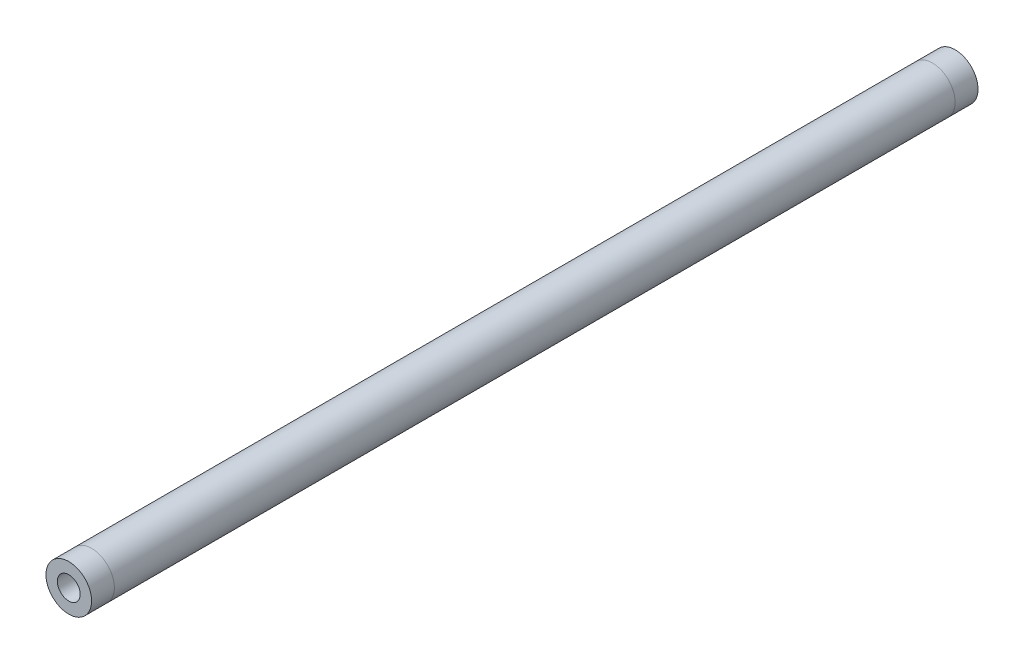
ISO-10303-21;
HEADER;
FILE_DESCRIPTION(('STEP AP214'),'2;1');
FILE_NAME('part.step','',(''),(''),'','','');
FILE_SCHEMA(('AUTOMOTIVE_DESIGN { 1 0 10303 214 1 1 1 1 }'));
ENDSEC;
DATA;
#1=APPLICATION_CONTEXT('core data for automotive mechanical design processes');
#2=APPLICATION_PROTOCOL_DEFINITION('international standard','automotive_design',2000,#1);
#3=PRODUCT_CONTEXT('',#1,'mechanical');
#4=PRODUCT('Part','Part','',(#3));
#5=PRODUCT_RELATED_PRODUCT_CATEGORY('part','',(#4));
#6=PRODUCT_DEFINITION_FORMATION('','',#4);
#7=PRODUCT_DEFINITION_CONTEXT('part definition',#1,'design');
#8=PRODUCT_DEFINITION('design','',#6,#7);
#9=PRODUCT_DEFINITION_SHAPE('','',#8);
#10=(LENGTH_UNIT() NAMED_UNIT(*) SI_UNIT(.MILLI.,.METRE.));
#11=(NAMED_UNIT(*) PLANE_ANGLE_UNIT() SI_UNIT($,.RADIAN.));
#12=(NAMED_UNIT(*) SI_UNIT($,.STERADIAN.) SOLID_ANGLE_UNIT());
#13=UNCERTAINTY_MEASURE_WITH_UNIT(LENGTH_MEASURE(1.E-05),#10,'distance_accuracy_value','');
#14=(GEOMETRIC_REPRESENTATION_CONTEXT(3) GLOBAL_UNCERTAINTY_ASSIGNED_CONTEXT((#13)) GLOBAL_UNIT_ASSIGNED_CONTEXT((#10,
#11,#12)) REPRESENTATION_CONTEXT('',''));
#15=CARTESIAN_POINT('',(0.,0.,0.));
#16=DIRECTION('',(0.,0.,1.));
#17=DIRECTION('',(1.,0.,0.));
#18=AXIS2_PLACEMENT_3D('',#15,#16,#17);
#19=CARTESIAN_POINT('',(0.,0.,-246.698789715622));
#20=DIRECTION('',(0.,0.,1.));
#21=DIRECTION('',(1.,0.,0.));
#22=AXIS2_PLACEMENT_3D('',#19,#20,#21);
#23=CYLINDRICAL_SURFACE('',#22,6.35);
#24=CARTESIAN_POINT('',(0.,0.,-246.698789715622));
#25=DIRECTION('',(0.,0.,1.));
#26=DIRECTION('',(1.,0.,0.));
#27=AXIS2_PLACEMENT_3D('',#24,#25,#26);
#28=CIRCLE('',#27,6.35);
#29=CARTESIAN_POINT('',(6.35,0.,-246.698789715622));
#30=VERTEX_POINT('',#29);
#31=EDGE_CURVE('E83',#30,#30,#28,.T.);
#32=ORIENTED_EDGE('',*,*,#31,.T.);
#33=EDGE_LOOP('',(#32));
#34=FACE_BOUND('',#33,.T.);
#35=CARTESIAN_POINT('',(0.,0.,-240.348789715622));
#36=DIRECTION('',(0.,0.,1.));
#37=DIRECTION('',(1.,0.,0.));
#38=AXIS2_PLACEMENT_3D('',#35,#36,#37);
#39=CIRCLE('',#38,6.35);
#40=CARTESIAN_POINT('',(6.35,0.,-240.348789715622));
#41=VERTEX_POINT('',#40);
#42=EDGE_CURVE('E79',#41,#41,#39,.T.);
#43=ORIENTED_EDGE('',*,*,#42,.F.);
#44=EDGE_LOOP('',(#43));
#45=FACE_BOUND('',#44,.T.);
#46=ADVANCED_FACE('F76',(#34,#45),#23,.T.);
#47=CARTESIAN_POINT('',(0.,0.,-246.698789715622));
#48=DIRECTION('',(0.,0.,1.));
#49=DIRECTION('',(1.,0.,0.));
#50=AXIS2_PLACEMENT_3D('',#47,#48,#49);
#51=PLANE('',#50);
#52=CARTESIAN_POINT('',(0.,0.,-246.698789715622));
#53=DIRECTION('',(0.,0.,1.));
#54=DIRECTION('',(1.,0.,0.));
#55=AXIS2_PLACEMENT_3D('',#52,#53,#54);
#56=CIRCLE('',#55,3.175);
#57=CARTESIAN_POINT('',(3.175,0.,-246.698789715622));
#58=VERTEX_POINT('',#57);
#59=EDGE_CURVE('E92',#58,#58,#56,.T.);
#60=ORIENTED_EDGE('',*,*,#59,.T.);
#61=EDGE_LOOP('',(#60));
#62=FACE_BOUND('',#61,.T.);
#63=ORIENTED_EDGE('',*,*,#31,.F.);
#64=EDGE_LOOP('',(#63));
#65=FACE_BOUND('',#64,.T.);
#66=ADVANCED_FACE('F119',(#62,#65),#51,.F.);
#67=CARTESIAN_POINT('',(0.,0.,-240.348789715622));
#68=DIRECTION('',(0.,0.,1.));
#69=DIRECTION('',(1.,0.,0.));
#70=AXIS2_PLACEMENT_3D('',#67,#68,#69);
#71=PLANE('',#70);
#72=CARTESIAN_POINT('',(0.,0.,-240.348789715622));
#73=DIRECTION('',(0.,0.,1.));
#74=DIRECTION('',(1.,0.,0.));
#75=AXIS2_PLACEMENT_3D('',#72,#73,#74);
#76=CIRCLE('',#75,5.461);
#77=CARTESIAN_POINT('',(5.461,0.,-240.348789715622));
#78=VERTEX_POINT('',#77);
#79=EDGE_CURVE('E12',#78,#78,#76,.T.);
#80=ORIENTED_EDGE('',*,*,#79,.F.);
#81=EDGE_LOOP('',(#80));
#82=FACE_BOUND('',#81,.T.);
#83=ORIENTED_EDGE('',*,*,#42,.T.);
#84=EDGE_LOOP('',(#83));
#85=FACE_BOUND('',#84,.T.);
#86=ADVANCED_FACE('F115',(#82,#85),#71,.T.);
#87=CARTESIAN_POINT('',(0.,0.,-246.698789715622));
#88=DIRECTION('',(0.,0.,1.));
#89=DIRECTION('',(1.,0.,0.));
#90=AXIS2_PLACEMENT_3D('',#87,#88,#89);
#91=CYLINDRICAL_SURFACE('',#90,3.175);
#92=ORIENTED_EDGE('',*,*,#59,.F.);
#93=EDGE_LOOP('',(#92));
#94=FACE_BOUND('',#93,.T.);
#95=CARTESIAN_POINT('',(0.,0.,-233.998789715622));
#96=DIRECTION('',(0.,0.,1.));
#97=DIRECTION('',(1.,0.,0.));
#98=AXIS2_PLACEMENT_3D('',#95,#96,#97);
#99=CIRCLE('',#98,3.175);
#100=CARTESIAN_POINT('',(3.175,0.,-233.998789715622));
#101=VERTEX_POINT('',#100);
#102=EDGE_CURVE('E98',#101,#101,#99,.T.);
#103=ORIENTED_EDGE('',*,*,#102,.T.);
#104=EDGE_LOOP('',(#103));
#105=FACE_BOUND('',#104,.T.);
#106=ADVANCED_FACE('F104',(#94,#105),#91,.F.);
#107=CARTESIAN_POINT('',(0.,0.,-233.998789715622));
#108=DIRECTION('',(0.,0.,1.));
#109=DIRECTION('',(1.,0.,0.));
#110=AXIS2_PLACEMENT_3D('',#107,#108,#109);
#111=PLANE('',#110);
#112=CARTESIAN_POINT('',(0.,0.,-233.998789715622));
#113=DIRECTION('',(0.,0.,1.));
#114=DIRECTION('',(1.,0.,0.));
#115=AXIS2_PLACEMENT_3D('',#112,#113,#114);
#116=CIRCLE('',#115,5.461);
#117=CARTESIAN_POINT('',(5.461,0.,-233.998789715622));
#118=VERTEX_POINT('',#117);
#119=EDGE_CURVE('E90',#118,#118,#116,.T.);
#120=ORIENTED_EDGE('',*,*,#119,.T.);
#121=EDGE_LOOP('',(#120));
#122=FACE_BOUND('',#121,.T.);
#123=ORIENTED_EDGE('',*,*,#102,.F.);
#124=EDGE_LOOP('',(#123));
#125=FACE_BOUND('',#124,.T.);
#126=ADVANCED_FACE('F106',(#122,#125),#111,.T.);
#127=CARTESIAN_POINT('',(0.,0.,-233.998789715622));
#128=DIRECTION('',(0.,0.,-1.));
#129=DIRECTION('',(-1.,0.,0.));
#130=AXIS2_PLACEMENT_3D('',#127,#128,#129);
#131=CYLINDRICAL_SURFACE('',#130,5.461);
#132=ORIENTED_EDGE('',*,*,#119,.F.);
#133=EDGE_LOOP('',(#132));
#134=FACE_BOUND('',#133,.T.);
#135=ORIENTED_EDGE('',*,*,#79,.T.);
#136=EDGE_LOOP('',(#135));
#137=FACE_BOUND('',#136,.T.);
#138=ADVANCED_FACE('F108',(#134,#137),#131,.T.);
#139=CLOSED_SHELL('',(#46,#66,#86,#106,#126,#138));
#140=MANIFOLD_SOLID_BREP('B2',#139);
#141=CARTESIAN_POINT('',(0.,0.,-240.348789715622));
#142=DIRECTION('',(0.,0.,1.));
#143=DIRECTION('',(1.,0.,0.));
#144=AXIS2_PLACEMENT_3D('',#141,#142,#143);
#145=CYLINDRICAL_SURFACE('',#144,6.35);
#146=CARTESIAN_POINT('',(0.,0.,-240.348789715622));
#147=DIRECTION('',(0.,0.,1.));
#148=DIRECTION('',(1.,0.,0.));
#149=AXIS2_PLACEMENT_3D('',#146,#147,#148);
#150=CIRCLE('',#149,6.35);
#151=CARTESIAN_POINT('',(6.35,0.,-240.348789715622));
#152=VERTEX_POINT('',#151);
#153=EDGE_CURVE('E75',#152,#152,#150,.T.);
#154=CARTESIAN_POINT('',(0.,0.,-6.35));
#155=DIRECTION('',(0.,0.,1.));
#156=DIRECTION('',(1.,0.,0.));
#157=AXIS2_PLACEMENT_3D('',#154,#155,#156);
#158=CIRCLE('',#157,6.35);
#159=CARTESIAN_POINT('',(6.35,0.,-6.34999999999999));
#160=VERTEX_POINT('',#159);
#161=EDGE_CURVE('E191',#160,#160,#158,.T.);
#162=CARTESIAN_POINT('',(6.35,0.,-240.348789715622));
#163=CARTESIAN_POINT('',(6.35,0.,-237.911302322751));
#164=CARTESIAN_POINT('',(6.35,0.,-235.47381492988));
#165=CARTESIAN_POINT('',(6.35,0.,-230.598840144138));
#166=CARTESIAN_POINT('',(6.35,0.,-228.161352751267));
#167=CARTESIAN_POINT('',(6.35,0.,-223.286377965525));
#168=CARTESIAN_POINT('',(6.35,0.,-220.848890572654));
#169=CARTESIAN_POINT('',(6.35,0.,-215.973915786912));
#170=CARTESIAN_POINT('',(6.35,0.,-213.536428394041));
#171=CARTESIAN_POINT('',(6.35,0.,-208.661453608298));
#172=CARTESIAN_POINT('',(6.35,0.,-206.223966215427));
#173=CARTESIAN_POINT('',(6.35,0.,-201.348991429685));
#174=CARTESIAN_POINT('',(6.35,0.,-198.911504036814));
#175=CARTESIAN_POINT('',(6.35,0.,-194.036529251072));
#176=CARTESIAN_POINT('',(6.35,0.,-191.599041858201));
#177=CARTESIAN_POINT('',(6.35,0.,-186.724067072459));
#178=CARTESIAN_POINT('',(6.35,0.,-184.286579679588));
#179=CARTESIAN_POINT('',(6.35,0.,-179.411604893846));
#180=CARTESIAN_POINT('',(6.35,0.,-176.974117500975));
#181=CARTESIAN_POINT('',(6.35,0.,-172.099142715232));
#182=CARTESIAN_POINT('',(6.35,0.,-169.661655322361));
#183=CARTESIAN_POINT('',(6.35,0.,-164.786680536619));
#184=CARTESIAN_POINT('',(6.35,0.,-162.349193143748));
#185=CARTESIAN_POINT('',(6.35,0.,-157.474218358006));
#186=CARTESIAN_POINT('',(6.35,0.,-155.036730965135));
#187=CARTESIAN_POINT('',(6.35,0.,-150.161756179393));
#188=CARTESIAN_POINT('',(6.35,0.,-147.724268786522));
#189=CARTESIAN_POINT('',(6.35,0.,-142.84929400078));
#190=CARTESIAN_POINT('',(6.35,0.,-140.411806607909));
#191=CARTESIAN_POINT('',(6.35,0.,-135.536831822166));
#192=CARTESIAN_POINT('',(6.35,0.,-133.099344429295));
#193=CARTESIAN_POINT('',(6.35,0.,-128.224369643553));
#194=CARTESIAN_POINT('',(6.35,0.,-125.786882250682));
#195=CARTESIAN_POINT('',(6.35,0.,-120.91190746494));
#196=CARTESIAN_POINT('',(6.35,0.,-118.474420072069));
#197=CARTESIAN_POINT('',(6.35,0.,-113.599445286327));
#198=CARTESIAN_POINT('',(6.35,0.,-111.161957893456));
#199=CARTESIAN_POINT('',(6.35,0.,-106.286983107714));
#200=CARTESIAN_POINT('',(6.35,0.,-103.849495714843));
#201=CARTESIAN_POINT('',(6.35,0.,-98.9745209291005));
#202=CARTESIAN_POINT('',(6.35,0.,-96.5370335362294));
#203=CARTESIAN_POINT('',(6.35,0.,-91.6620587504873));
#204=CARTESIAN_POINT('',(6.35,0.,-89.2245713576162));
#205=CARTESIAN_POINT('',(6.35,0.,-84.3495965718741));
#206=CARTESIAN_POINT('',(6.35,0.,-81.912109179003));
#207=CARTESIAN_POINT('',(6.35,0.,-77.0371343932609));
#208=CARTESIAN_POINT('',(6.35,0.,-74.5996470003898));
#209=CARTESIAN_POINT('',(6.35,0.,-69.7246722146477));
#210=CARTESIAN_POINT('',(6.35,0.,-67.2871848217766));
#211=CARTESIAN_POINT('',(6.35,0.,-62.4122100360345));
#212=CARTESIAN_POINT('',(6.35,0.,-59.9747226431634));
#213=CARTESIAN_POINT('',(6.35,0.,-55.0997478574213));
#214=CARTESIAN_POINT('',(6.35,0.,-52.6622604645502));
#215=CARTESIAN_POINT('',(6.35,0.,-47.7872856788081));
#216=CARTESIAN_POINT('',(6.35,0.,-45.349798285937));
#217=CARTESIAN_POINT('',(6.35,0.,-40.4748235001949));
#218=CARTESIAN_POINT('',(6.35,0.,-38.0373361073239));
#219=CARTESIAN_POINT('',(6.35,0.,-33.1623613215817));
#220=CARTESIAN_POINT('',(6.35,0.,-30.7248739287107));
#221=CARTESIAN_POINT('',(6.35,0.,-25.8498991429685));
#222=CARTESIAN_POINT('',(6.35,0.,-23.4124117500975));
#223=CARTESIAN_POINT('',(6.35,0.,-18.5374369643553));
#224=CARTESIAN_POINT('',(6.35,0.,-16.0999495714843));
#225=CARTESIAN_POINT('',(6.35,0.,-11.2249747857421));
#226=CARTESIAN_POINT('',(6.35,0.,-8.78748739287106));
#227=CARTESIAN_POINT('',(6.35,0.,-6.34999999999999));
#228=B_SPLINE_CURVE_WITH_KNOTS('',3,(#162,#163,#164,#165,#166,#167,#168,#169,#170,#171,#172,
#173,#174,#175,#176,#177,#178,#179,#180,#181,#182,#183,#184,#185,#186,#187,#188,#189,#190,#191,
#192,#193,#194,#195,#196,#197,#198,#199,#200,#201,#202,#203,#204,#205,#206,#207,#208,#209,#210,
#211,#212,#213,#214,#215,#216,#217,#218,#219,#220,#221,#222,#223,#224,#225,#226,#227),
.UNSPECIFIED.,.F.,.F.,(4,2,2,2,2,2,2,2,2,2,2,2,2,2,2,2,2,2,2,2,2,2,2,2,2,2,2,2,2,2,2,2,4),(0.,
7.31246217861317,14.6249243572264,21.9373865358396,29.2498487144528,36.562310893066,
43.8747730716791,51.1872352502923,58.4996974289055,65.8121596075187,73.1246217861319,
80.4370839647451,87.7495461433583,95.0620083219715,102.374470500585,109.686932679198,
116.999394857811,124.311857036424,131.624319215038,138.936781393651,146.249243572264,
153.561705750877,160.87416792949,168.186630108103,175.499092286717,182.81155446533,
190.124016643943,197.436478822556,204.748941001169,212.061403179783,219.373865358396,
226.686327537009,233.998789715622),.UNSPECIFIED.);
#229=EDGE_CURVE('BSEAM188',#152,#160,#228,.T.);
#230=ORIENTED_EDGE('',*,*,#153,.T.);
#231=ORIENTED_EDGE('',*,*,#161,.F.);
#232=ORIENTED_EDGE('',*,*,#229,.T.);
#233=ORIENTED_EDGE('',*,*,#229,.F.);
#234=EDGE_LOOP('',(#230,#232,#231,#233));
#235=FACE_BOUND('',#234,.T.);
#236=ADVANCED_FACE('F188',(#235),#145,.T.);
#237=CARTESIAN_POINT('',(0.,0.,-240.348789715622));
#238=DIRECTION('',(0.,0.,1.));
#239=DIRECTION('',(1.,0.,0.));
#240=AXIS2_PLACEMENT_3D('',#237,#238,#239);
#241=PLANE('',#240);
#242=CARTESIAN_POINT('',(0.,0.,-240.348789715622));
#243=DIRECTION('',(0.,0.,1.));
#244=DIRECTION('',(1.,0.,0.));
#245=AXIS2_PLACEMENT_3D('',#242,#243,#244);
#246=CIRCLE('',#245,5.461);
#247=CARTESIAN_POINT('',(5.461,0.,-240.348789715622));
#248=VERTEX_POINT('',#247);
#249=EDGE_CURVE('E198',#248,#248,#246,.T.);
#250=ORIENTED_EDGE('',*,*,#249,.T.);
#251=EDGE_LOOP('',(#250));
#252=FACE_BOUND('',#251,.T.);
#253=ORIENTED_EDGE('',*,*,#153,.F.);
#254=EDGE_LOOP('',(#253));
#255=FACE_BOUND('',#254,.T.);
#256=ADVANCED_FACE('F206',(#252,#255),#241,.F.);
#257=CARTESIAN_POINT('',(0.,0.,-6.35));
#258=DIRECTION('',(0.,0.,1.));
#259=DIRECTION('',(1.,0.,0.));
#260=AXIS2_PLACEMENT_3D('',#257,#258,#259);
#261=PLANE('',#260);
#262=CARTESIAN_POINT('',(0.,0.,-6.35));
#263=DIRECTION('',(0.,0.,1.));
#264=DIRECTION('',(1.,0.,0.));
#265=AXIS2_PLACEMENT_3D('',#262,#263,#264);
#266=CIRCLE('',#265,5.461);
#267=CARTESIAN_POINT('',(5.461,0.,-6.34999999999999));
#268=VERTEX_POINT('',#267);
#269=EDGE_CURVE('E200',#268,#268,#266,.T.);
#270=ORIENTED_EDGE('',*,*,#269,.F.);
#271=EDGE_LOOP('',(#270));
#272=FACE_BOUND('',#271,.T.);
#273=ORIENTED_EDGE('',*,*,#161,.T.);
#274=EDGE_LOOP('',(#273));
#275=FACE_BOUND('',#274,.T.);
#276=ADVANCED_FACE('F212',(#272,#275),#261,.T.);
#277=CARTESIAN_POINT('',(0.,0.,-240.348789715622));
#278=DIRECTION('',(0.,0.,1.));
#279=DIRECTION('',(1.,0.,0.));
#280=AXIS2_PLACEMENT_3D('',#277,#278,#279);
#281=CYLINDRICAL_SURFACE('',#280,5.461);
#282=CARTESIAN_POINT('',(5.461,0.,-240.348789715622));
#283=CARTESIAN_POINT('',(5.461,0.,-237.911302322751));
#284=CARTESIAN_POINT('',(5.461,0.,-235.47381492988));
#285=CARTESIAN_POINT('',(5.461,0.,-230.598840144138));
#286=CARTESIAN_POINT('',(5.461,0.,-228.161352751267));
#287=CARTESIAN_POINT('',(5.461,0.,-223.286377965525));
#288=CARTESIAN_POINT('',(5.461,0.,-220.848890572654));
#289=CARTESIAN_POINT('',(5.461,0.,-215.973915786912));
#290=CARTESIAN_POINT('',(5.461,0.,-213.536428394041));
#291=CARTESIAN_POINT('',(5.461,0.,-208.661453608298));
#292=CARTESIAN_POINT('',(5.461,0.,-206.223966215427));
#293=CARTESIAN_POINT('',(5.461,0.,-201.348991429685));
#294=CARTESIAN_POINT('',(5.461,0.,-198.911504036814));
#295=CARTESIAN_POINT('',(5.461,0.,-194.036529251072));
#296=CARTESIAN_POINT('',(5.461,0.,-191.599041858201));
#297=CARTESIAN_POINT('',(5.461,0.,-186.724067072459));
#298=CARTESIAN_POINT('',(5.461,0.,-184.286579679588));
#299=CARTESIAN_POINT('',(5.461,0.,-179.411604893846));
#300=CARTESIAN_POINT('',(5.461,0.,-176.974117500975));
#301=CARTESIAN_POINT('',(5.461,0.,-172.099142715232));
#302=CARTESIAN_POINT('',(5.461,0.,-169.661655322361));
#303=CARTESIAN_POINT('',(5.461,0.,-164.786680536619));
#304=CARTESIAN_POINT('',(5.461,0.,-162.349193143748));
#305=CARTESIAN_POINT('',(5.461,0.,-157.474218358006));
#306=CARTESIAN_POINT('',(5.461,0.,-155.036730965135));
#307=CARTESIAN_POINT('',(5.461,0.,-150.161756179393));
#308=CARTESIAN_POINT('',(5.461,0.,-147.724268786522));
#309=CARTESIAN_POINT('',(5.461,0.,-142.84929400078));
#310=CARTESIAN_POINT('',(5.461,0.,-140.411806607909));
#311=CARTESIAN_POINT('',(5.461,0.,-135.536831822166));
#312=CARTESIAN_POINT('',(5.461,0.,-133.099344429295));
#313=CARTESIAN_POINT('',(5.461,0.,-128.224369643553));
#314=CARTESIAN_POINT('',(5.461,0.,-125.786882250682));
#315=CARTESIAN_POINT('',(5.461,0.,-120.91190746494));
#316=CARTESIAN_POINT('',(5.461,0.,-118.474420072069));
#317=CARTESIAN_POINT('',(5.461,0.,-113.599445286327));
#318=CARTESIAN_POINT('',(5.461,0.,-111.161957893456));
#319=CARTESIAN_POINT('',(5.461,0.,-106.286983107714));
#320=CARTESIAN_POINT('',(5.461,0.,-103.849495714843));
#321=CARTESIAN_POINT('',(5.461,0.,-98.9745209291005));
#322=CARTESIAN_POINT('',(5.461,0.,-96.5370335362294));
#323=CARTESIAN_POINT('',(5.461,0.,-91.6620587504873));
#324=CARTESIAN_POINT('',(5.461,0.,-89.2245713576162));
#325=CARTESIAN_POINT('',(5.461,0.,-84.3495965718741));
#326=CARTESIAN_POINT('',(5.461,0.,-81.912109179003));
#327=CARTESIAN_POINT('',(5.461,0.,-77.0371343932609));
#328=CARTESIAN_POINT('',(5.461,0.,-74.5996470003898));
#329=CARTESIAN_POINT('',(5.461,0.,-69.7246722146477));
#330=CARTESIAN_POINT('',(5.461,0.,-67.2871848217766));
#331=CARTESIAN_POINT('',(5.461,0.,-62.4122100360345));
#332=CARTESIAN_POINT('',(5.461,0.,-59.9747226431634));
#333=CARTESIAN_POINT('',(5.461,0.,-55.0997478574213));
#334=CARTESIAN_POINT('',(5.461,0.,-52.6622604645502));
#335=CARTESIAN_POINT('',(5.461,0.,-47.7872856788081));
#336=CARTESIAN_POINT('',(5.461,0.,-45.349798285937));
#337=CARTESIAN_POINT('',(5.461,0.,-40.4748235001949));
#338=CARTESIAN_POINT('',(5.461,0.,-38.0373361073239));
#339=CARTESIAN_POINT('',(5.461,0.,-33.1623613215817));
#340=CARTESIAN_POINT('',(5.461,0.,-30.7248739287107));
#341=CARTESIAN_POINT('',(5.461,0.,-25.8498991429685));
#342=CARTESIAN_POINT('',(5.461,0.,-23.4124117500975));
#343=CARTESIAN_POINT('',(5.461,0.,-18.5374369643553));
#344=CARTESIAN_POINT('',(5.461,0.,-16.0999495714843));
#345=CARTESIAN_POINT('',(5.461,0.,-11.2249747857421));
#346=CARTESIAN_POINT('',(5.461,0.,-8.78748739287106));
#347=CARTESIAN_POINT('',(5.461,0.,-6.34999999999999));
#348=B_SPLINE_CURVE_WITH_KNOTS('',3,(#282,#283,#284,#285,#286,#287,#288,#289,#290,#291,#292,
#293,#294,#295,#296,#297,#298,#299,#300,#301,#302,#303,#304,#305,#306,#307,#308,#309,#310,#311,
#312,#313,#314,#315,#316,#317,#318,#319,#320,#321,#322,#323,#324,#325,#326,#327,#328,#329,#330,
#331,#332,#333,#334,#335,#336,#337,#338,#339,#340,#341,#342,#343,#344,#345,#346,#347),
.UNSPECIFIED.,.F.,.F.,(4,2,2,2,2,2,2,2,2,2,2,2,2,2,2,2,2,2,2,2,2,2,2,2,2,2,2,2,2,2,2,2,4),(0.,
7.31246217861317,14.6249243572264,21.9373865358396,29.2498487144528,36.562310893066,
43.8747730716791,51.1872352502923,58.4996974289055,65.8121596075187,73.1246217861319,
80.4370839647451,87.7495461433583,95.0620083219715,102.374470500585,109.686932679198,
116.999394857811,124.311857036424,131.624319215038,138.936781393651,146.249243572264,
153.561705750877,160.87416792949,168.186630108103,175.499092286717,182.81155446533,
190.124016643943,197.436478822556,204.748941001169,212.061403179783,219.373865358396,
226.686327537009,233.998789715622),.UNSPECIFIED.);
#349=EDGE_CURVE('BSEAM209',#248,#268,#348,.T.);
#350=ORIENTED_EDGE('',*,*,#249,.F.);
#351=ORIENTED_EDGE('',*,*,#269,.T.);
#352=ORIENTED_EDGE('',*,*,#349,.T.);
#353=ORIENTED_EDGE('',*,*,#349,.F.);
#354=EDGE_LOOP('',(#350,#352,#351,#353));
#355=FACE_BOUND('',#354,.T.);
#356=ADVANCED_FACE('F209',(#355),#281,.F.);
#357=CLOSED_SHELL('',(#236,#256,#276,#356));
#358=MANIFOLD_SOLID_BREP('B7',#357);
#359=CARTESIAN_POINT('',(0.,0.,-6.35));
#360=DIRECTION('',(0.,0.,1.));
#361=DIRECTION('',(1.,0.,0.));
#362=AXIS2_PLACEMENT_3D('',#359,#360,#361);
#363=CYLINDRICAL_SURFACE('',#362,6.35);
#364=CARTESIAN_POINT('',(0.,0.,-6.35));
#365=DIRECTION('',(0.,0.,1.));
#366=DIRECTION('',(1.,0.,0.));
#367=AXIS2_PLACEMENT_3D('',#364,#365,#366);
#368=CIRCLE('',#367,6.35);
#369=CARTESIAN_POINT('',(6.35,0.,-6.35));
#370=VERTEX_POINT('',#369);
#371=EDGE_CURVE('E187',#370,#370,#368,.T.);
#372=ORIENTED_EDGE('',*,*,#371,.T.);
#373=EDGE_LOOP('',(#372));
#374=FACE_BOUND('',#373,.T.);
#375=CARTESIAN_POINT('',(0.,0.,0.));
#376=DIRECTION('',(0.,0.,1.));
#377=DIRECTION('',(1.,0.,0.));
#378=AXIS2_PLACEMENT_3D('',#375,#376,#377);
#379=CIRCLE('',#378,6.35);
#380=CARTESIAN_POINT('',(6.35,0.,0.));
#381=VERTEX_POINT('',#380);
#382=EDGE_CURVE('E261',#381,#381,#379,.T.);
#383=ORIENTED_EDGE('',*,*,#382,.F.);
#384=EDGE_LOOP('',(#383));
#385=FACE_BOUND('',#384,.T.);
#386=ADVANCED_FACE('F250',(#374,#385),#363,.T.);
#387=CARTESIAN_POINT('',(0.,0.,-6.35));
#388=DIRECTION('',(0.,0.,1.));
#389=DIRECTION('',(1.,0.,0.));
#390=AXIS2_PLACEMENT_3D('',#387,#388,#389);
#391=CYLINDRICAL_SURFACE('',#390,3.175);
#392=CARTESIAN_POINT('',(0.,0.,0.));
#393=DIRECTION('',(0.,0.,1.));
#394=DIRECTION('',(1.,0.,0.));
#395=AXIS2_PLACEMENT_3D('',#392,#393,#394);
#396=CIRCLE('',#395,3.175);
#397=CARTESIAN_POINT('',(3.175,0.,0.));
#398=VERTEX_POINT('',#397);
#399=EDGE_CURVE('E253',#398,#398,#396,.T.);
#400=ORIENTED_EDGE('',*,*,#399,.T.);
#401=EDGE_LOOP('',(#400));
#402=FACE_BOUND('',#401,.T.);
#403=CARTESIAN_POINT('',(0.,0.,-12.7));
#404=DIRECTION('',(0.,0.,1.));
#405=DIRECTION('',(1.,0.,0.));
#406=AXIS2_PLACEMENT_3D('',#403,#404,#405);
#407=CIRCLE('',#406,3.175);
#408=CARTESIAN_POINT('',(3.175,0.,-12.7));
#409=VERTEX_POINT('',#408);
#410=EDGE_CURVE('E273',#409,#409,#407,.T.);
#411=ORIENTED_EDGE('',*,*,#410,.F.);
#412=EDGE_LOOP('',(#411));
#413=FACE_BOUND('',#412,.T.);
#414=ADVANCED_FACE('F281',(#402,#413),#391,.F.);
#415=CARTESIAN_POINT('',(0.,0.,-6.35));
#416=DIRECTION('',(0.,0.,1.));
#417=DIRECTION('',(1.,0.,0.));
#418=AXIS2_PLACEMENT_3D('',#415,#416,#417);
#419=PLANE('',#418);
#420=CARTESIAN_POINT('',(0.,0.,-6.35));
#421=DIRECTION('',(0.,0.,1.));
#422=DIRECTION('',(1.,0.,0.));
#423=AXIS2_PLACEMENT_3D('',#420,#421,#422);
#424=CIRCLE('',#423,5.461);
#425=CARTESIAN_POINT('',(5.461,0.,-6.35));
#426=VERTEX_POINT('',#425);
#427=EDGE_CURVE('E263',#426,#426,#424,.T.);
#428=ORIENTED_EDGE('',*,*,#427,.T.);
#429=EDGE_LOOP('',(#428));
#430=FACE_BOUND('',#429,.T.);
#431=ORIENTED_EDGE('',*,*,#371,.F.);
#432=EDGE_LOOP('',(#431));
#433=FACE_BOUND('',#432,.T.);
#434=ADVANCED_FACE('F283',(#430,#433),#419,.F.);
#435=CARTESIAN_POINT('',(0.,0.,0.));
#436=DIRECTION('',(0.,0.,1.));
#437=DIRECTION('',(1.,0.,0.));
#438=AXIS2_PLACEMENT_3D('',#435,#436,#437);
#439=PLANE('',#438);
#440=ORIENTED_EDGE('',*,*,#382,.T.);
#441=EDGE_LOOP('',(#440));
#442=FACE_BOUND('',#441,.T.);
#443=ORIENTED_EDGE('',*,*,#399,.F.);
#444=EDGE_LOOP('',(#443));
#445=FACE_BOUND('',#444,.T.);
#446=ADVANCED_FACE('F289',(#442,#445),#439,.T.);
#447=CARTESIAN_POINT('',(0.,0.,-12.7));
#448=DIRECTION('',(0.,0.,1.));
#449=DIRECTION('',(1.,0.,0.));
#450=AXIS2_PLACEMENT_3D('',#447,#448,#449);
#451=CYLINDRICAL_SURFACE('',#450,5.461);
#452=CARTESIAN_POINT('',(0.,0.,-12.7));
#453=DIRECTION('',(0.,0.,1.));
#454=DIRECTION('',(1.,0.,0.));
#455=AXIS2_PLACEMENT_3D('',#452,#453,#454);
#456=CIRCLE('',#455,5.461);
#457=CARTESIAN_POINT('',(5.461,0.,-12.7));
#458=VERTEX_POINT('',#457);
#459=EDGE_CURVE('E266',#458,#458,#456,.T.);
#460=ORIENTED_EDGE('',*,*,#459,.T.);
#461=EDGE_LOOP('',(#460));
#462=FACE_BOUND('',#461,.T.);
#463=ORIENTED_EDGE('',*,*,#427,.F.);
#464=EDGE_LOOP('',(#463));
#465=FACE_BOUND('',#464,.T.);
#466=ADVANCED_FACE('F294',(#462,#465),#451,.T.);
#467=CARTESIAN_POINT('',(0.,0.,-12.7));
#468=DIRECTION('',(0.,0.,1.));
#469=DIRECTION('',(1.,0.,0.));
#470=AXIS2_PLACEMENT_3D('',#467,#468,#469);
#471=PLANE('',#470);
#472=ORIENTED_EDGE('',*,*,#410,.T.);
#473=EDGE_LOOP('',(#472));
#474=FACE_BOUND('',#473,.T.);
#475=ORIENTED_EDGE('',*,*,#459,.F.);
#476=EDGE_LOOP('',(#475));
#477=FACE_BOUND('',#476,.T.);
#478=ADVANCED_FACE('F278',(#474,#477),#471,.F.);
#479=CLOSED_SHELL('',(#386,#414,#434,#446,#466,#478));
#480=MANIFOLD_SOLID_BREP('B70',#479);
#481=ADVANCED_BREP_SHAPE_REPRESENTATION('',(#18,#140,#358,#480),#14);
#482=SHAPE_DEFINITION_REPRESENTATION(#9,#481);
ENDSEC;
END-ISO-10303-21;
